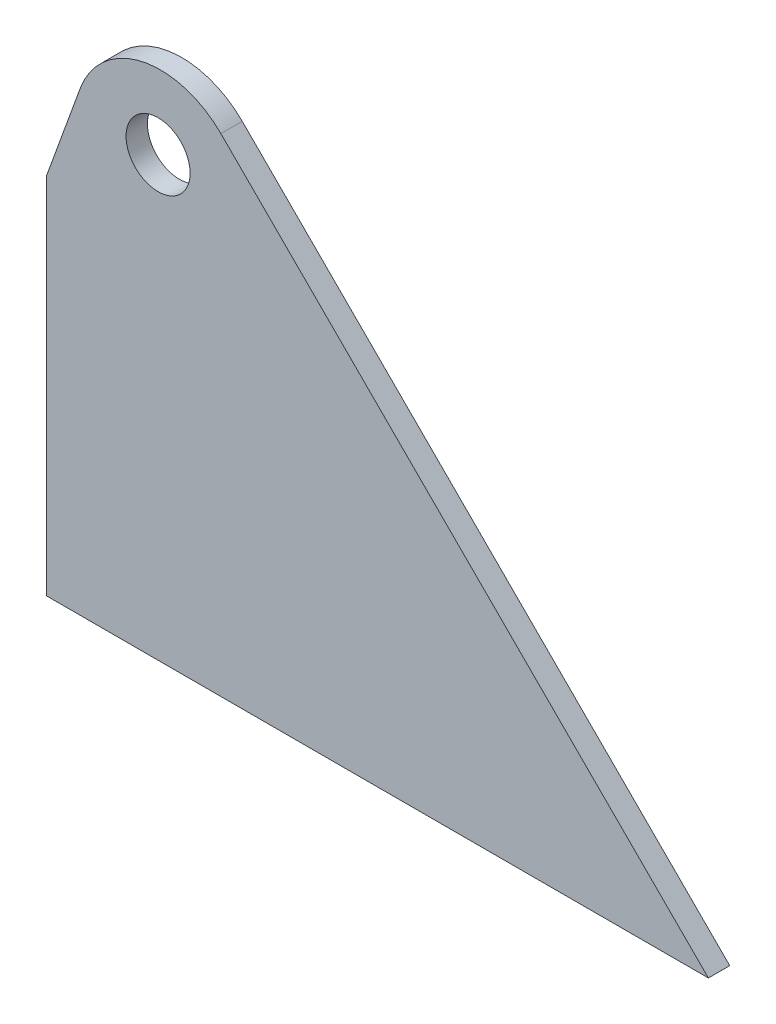
ISO-10303-21;
HEADER;
FILE_DESCRIPTION(('STEP AP214'),'2;1');
FILE_NAME('part.step','',(''),(''),'','','');
FILE_SCHEMA(('AUTOMOTIVE_DESIGN { 1 0 10303 214 1 1 1 1 }'));
ENDSEC;
DATA;
#1=APPLICATION_CONTEXT('core data for automotive mechanical design processes');
#2=APPLICATION_PROTOCOL_DEFINITION('international standard','automotive_design',2000,#1);
#3=PRODUCT_CONTEXT('',#1,'mechanical');
#4=PRODUCT('Part','Part','',(#3));
#5=PRODUCT_RELATED_PRODUCT_CATEGORY('part','',(#4));
#6=PRODUCT_DEFINITION_FORMATION('','',#4);
#7=PRODUCT_DEFINITION_CONTEXT('part definition',#1,'design');
#8=PRODUCT_DEFINITION('design','',#6,#7);
#9=PRODUCT_DEFINITION_SHAPE('','',#8);
#10=(LENGTH_UNIT() NAMED_UNIT(*) SI_UNIT(.MILLI.,.METRE.));
#11=(NAMED_UNIT(*) PLANE_ANGLE_UNIT() SI_UNIT($,.RADIAN.));
#12=(NAMED_UNIT(*) SI_UNIT($,.STERADIAN.) SOLID_ANGLE_UNIT());
#13=UNCERTAINTY_MEASURE_WITH_UNIT(LENGTH_MEASURE(1.E-05),#10,'distance_accuracy_value','');
#14=(GEOMETRIC_REPRESENTATION_CONTEXT(3) GLOBAL_UNCERTAINTY_ASSIGNED_CONTEXT((#13)) GLOBAL_UNIT_ASSIGNED_CONTEXT((#10,
#11,#12)) REPRESENTATION_CONTEXT('',''));
#15=CARTESIAN_POINT('',(0.,0.,0.));
#16=DIRECTION('',(0.,0.,1.));
#17=DIRECTION('',(1.,0.,0.));
#18=AXIS2_PLACEMENT_3D('',#15,#16,#17);
#19=CARTESIAN_POINT('',(53.471605318108,199.959852186968,10.));
#20=DIRECTION('',(0.,0.,1.));
#21=DIRECTION('',(1.,0.,0.));
#22=AXIS2_PLACEMENT_3D('',#19,#20,#21);
#23=PLANE('',#22);
#24=DIRECTION('',(1.,0.,0.));
#25=VECTOR('',#24,1.);
#26=CARTESIAN_POINT('',(309.999999999999,0.,10.));
#27=LINE('',#26,#25);
#28=CARTESIAN_POINT('',(0.,0.,10.));
#29=VERTEX_POINT('',#28);
#30=CARTESIAN_POINT('',(309.999999999999,0.,10.));
#31=VERTEX_POINT('',#30);
#32=EDGE_CURVE('E116',#29,#31,#27,.T.);
#33=ORIENTED_EDGE('',*,*,#32,.T.);
#34=DIRECTION('',(-0.707106781186546,0.707106781186549,0.));
#35=VECTOR('',#34,1.);
#36=CARTESIAN_POINT('',(309.999999999999,0.,10.));
#37=LINE('',#36,#35);
#38=CARTESIAN_POINT('',(81.7558765655699,228.24412343443,10.));
#39=VERTEX_POINT('',#38);
#40=EDGE_CURVE('E83',#31,#39,#37,.T.);
#41=ORIENTED_EDGE('',*,*,#40,.T.);
#42=CARTESIAN_POINT('',(53.471605318108,199.959852186968,10.));
#43=DIRECTION('',(0.,0.,1.));
#44=DIRECTION('',(1.,0.,0.));
#45=AXIS2_PLACEMENT_3D('',#42,#43,#44);
#46=CIRCLE('',#45,40.);
#47=CARTESIAN_POINT('',(15.8839004866716,213.640657919995,10.));
#48=VERTEX_POINT('',#47);
#49=EDGE_CURVE('E87',#39,#48,#46,.T.);
#50=ORIENTED_EDGE('',*,*,#49,.T.);
#51=DIRECTION('',(-0.342020143325666,-0.93969262078591,0.));
#52=VECTOR('',#51,1.);
#53=CARTESIAN_POINT('',(15.8839004866716,213.640657919995,10.));
#54=LINE('',#53,#52);
#55=CARTESIAN_POINT('',(0.,170.,10.));
#56=VERTEX_POINT('',#55);
#57=EDGE_CURVE('E91',#48,#56,#54,.T.);
#58=ORIENTED_EDGE('',*,*,#57,.T.);
#59=DIRECTION('',(0.,-1.,0.));
#60=VECTOR('',#59,1.);
#61=CARTESIAN_POINT('',(0.,0.,10.));
#62=LINE('',#61,#60);
#63=EDGE_CURVE('E49',#56,#29,#62,.T.);
#64=ORIENTED_EDGE('',*,*,#63,.T.);
#65=EDGE_LOOP('',(#33,#41,#50,#58,#64));
#66=FACE_BOUND('',#65,.T.);
#67=CARTESIAN_POINT('',(52.3542314490274,205.,10.));
#68=DIRECTION('',(0.,0.,1.));
#69=DIRECTION('',(1.,0.,0.));
#70=AXIS2_PLACEMENT_3D('',#67,#68,#69);
#71=CIRCLE('',#70,15.);
#72=CARTESIAN_POINT('',(67.3542314490274,205.,10.));
#73=VERTEX_POINT('',#72);
#74=EDGE_CURVE('E111',#73,#73,#71,.T.);
#75=ORIENTED_EDGE('',*,*,#74,.F.);
#76=EDGE_LOOP('',(#75));
#77=FACE_BOUND('',#76,.T.);
#78=ADVANCED_FACE('F32',(#66,#77),#23,.T.);
#79=CARTESIAN_POINT('',(53.471605318108,199.959852186968,0.));
#80=DIRECTION('',(0.,0.,1.));
#81=DIRECTION('',(1.,0.,0.));
#82=AXIS2_PLACEMENT_3D('',#79,#80,#81);
#83=PLANE('',#82);
#84=DIRECTION('',(1.,0.,0.));
#85=VECTOR('',#84,1.);
#86=CARTESIAN_POINT('',(309.999999999999,0.,0.));
#87=LINE('',#86,#85);
#88=CARTESIAN_POINT('',(0.,0.,0.));
#89=VERTEX_POINT('',#88);
#90=CARTESIAN_POINT('',(309.999999999999,0.,0.));
#91=VERTEX_POINT('',#90);
#92=EDGE_CURVE('E107',#89,#91,#87,.T.);
#93=ORIENTED_EDGE('',*,*,#92,.F.);
#94=DIRECTION('',(0.,-1.,0.));
#95=VECTOR('',#94,1.);
#96=CARTESIAN_POINT('',(0.,0.,0.));
#97=LINE('',#96,#95);
#98=CARTESIAN_POINT('',(0.,170.,0.));
#99=VERTEX_POINT('',#98);
#100=EDGE_CURVE('E75',#99,#89,#97,.T.);
#101=ORIENTED_EDGE('',*,*,#100,.F.);
#102=DIRECTION('',(-0.342020143325666,-0.93969262078591,0.));
#103=VECTOR('',#102,1.);
#104=CARTESIAN_POINT('',(15.8839004866716,213.640657919995,0.));
#105=LINE('',#104,#103);
#106=CARTESIAN_POINT('',(15.8839004866716,213.640657919995,0.));
#107=VERTEX_POINT('',#106);
#108=EDGE_CURVE('E69',#107,#99,#105,.T.);
#109=ORIENTED_EDGE('',*,*,#108,.F.);
#110=CARTESIAN_POINT('',(53.471605318108,199.959852186968,0.));
#111=DIRECTION('',(0.,0.,1.));
#112=DIRECTION('',(1.,0.,0.));
#113=AXIS2_PLACEMENT_3D('',#110,#111,#112);
#114=CIRCLE('',#113,40.);
#115=CARTESIAN_POINT('',(81.7558765655699,228.24412343443,0.));
#116=VERTEX_POINT('',#115);
#117=EDGE_CURVE('E98',#116,#107,#114,.T.);
#118=ORIENTED_EDGE('',*,*,#117,.F.);
#119=DIRECTION('',(-0.707106781186545,0.707106781186551,0.));
#120=VECTOR('',#119,1.);
#121=CARTESIAN_POINT('',(90.,220.,0.));
#122=LINE('',#121,#120);
#123=EDGE_CURVE('E110',#91,#116,#122,.T.);
#124=ORIENTED_EDGE('',*,*,#123,.F.);
#125=EDGE_LOOP('',(#93,#101,#109,#118,#124));
#126=FACE_BOUND('',#125,.T.);
#127=CARTESIAN_POINT('',(52.3542314490274,205.,0.));
#128=DIRECTION('',(0.,0.,1.));
#129=DIRECTION('',(1.,0.,0.));
#130=AXIS2_PLACEMENT_3D('',#127,#128,#129);
#131=CIRCLE('',#130,15.);
#132=CARTESIAN_POINT('',(67.3542314490274,205.,0.));
#133=VERTEX_POINT('',#132);
#134=EDGE_CURVE('E202',#133,#133,#131,.T.);
#135=ORIENTED_EDGE('',*,*,#134,.T.);
#136=EDGE_LOOP('',(#135));
#137=FACE_BOUND('',#136,.T.);
#138=ADVANCED_FACE('F120',(#126,#137),#83,.F.);
#139=CARTESIAN_POINT('',(309.999999999999,0.,10.));
#140=DIRECTION('',(0.,1.,0.));
#141=DIRECTION('',(-1.,0.,0.));
#142=AXIS2_PLACEMENT_3D('',#139,#140,#141);
#143=PLANE('',#142);
#144=ORIENTED_EDGE('',*,*,#92,.T.);
#145=DIRECTION('',(0.,0.,-1.));
#146=VECTOR('',#145,1.);
#147=CARTESIAN_POINT('',(309.999999999999,0.,10.));
#148=LINE('',#147,#146);
#149=EDGE_CURVE('E11',#31,#91,#148,.T.);
#150=ORIENTED_EDGE('',*,*,#149,.F.);
#151=ORIENTED_EDGE('',*,*,#32,.F.);
#152=DIRECTION('',(0.,0.,-1.));
#153=VECTOR('',#152,1.);
#154=CARTESIAN_POINT('',(0.,0.,10.));
#155=LINE('',#154,#153);
#156=EDGE_CURVE('E103',#29,#89,#155,.T.);
#157=ORIENTED_EDGE('',*,*,#156,.T.);
#158=EDGE_LOOP('',(#144,#150,#151,#157));
#159=FACE_BOUND('',#158,.T.);
#160=ADVANCED_FACE('F34',(#159),#143,.F.);
#161=CARTESIAN_POINT('',(90.,220.,10.));
#162=DIRECTION('',(-0.707106781186551,-0.707106781186545,0.));
#163=DIRECTION('',(0.707106781186545,-0.70710678118655,0.));
#164=AXIS2_PLACEMENT_3D('',#161,#162,#163);
#165=PLANE('',#164);
#166=ORIENTED_EDGE('',*,*,#123,.T.);
#167=DIRECTION('',(0.,0.,-1.));
#168=VECTOR('',#167,1.);
#169=CARTESIAN_POINT('',(81.7558765655699,228.24412343443,10.));
#170=LINE('',#169,#168);
#171=EDGE_CURVE('E41',#39,#116,#170,.T.);
#172=ORIENTED_EDGE('',*,*,#171,.F.);
#173=ORIENTED_EDGE('',*,*,#40,.F.);
#174=ORIENTED_EDGE('',*,*,#149,.T.);
#175=EDGE_LOOP('',(#166,#172,#173,#174));
#176=FACE_BOUND('',#175,.T.);
#177=ADVANCED_FACE('F145',(#176),#165,.F.);
#178=CARTESIAN_POINT('',(53.471605318108,199.959852186968,10.));
#179=DIRECTION('',(0.,0.,-1.));
#180=DIRECTION('',(-1.,0.,0.));
#181=AXIS2_PLACEMENT_3D('',#178,#179,#180);
#182=CYLINDRICAL_SURFACE('',#181,40.);
#183=ORIENTED_EDGE('',*,*,#117,.T.);
#184=DIRECTION('',(0.,0.,-1.));
#185=VECTOR('',#184,1.);
#186=CARTESIAN_POINT('',(15.8839004866716,213.640657919995,10.));
#187=LINE('',#186,#185);
#188=EDGE_CURVE('E95',#48,#107,#187,.T.);
#189=ORIENTED_EDGE('',*,*,#188,.F.);
#190=ORIENTED_EDGE('',*,*,#49,.F.);
#191=ORIENTED_EDGE('',*,*,#171,.T.);
#192=EDGE_LOOP('',(#183,#189,#190,#191));
#193=FACE_BOUND('',#192,.T.);
#194=ADVANCED_FACE('F96',(#193),#182,.T.);
#195=CARTESIAN_POINT('',(15.8839004866716,213.640657919995,10.));
#196=DIRECTION('',(0.939692620785909,-0.342020143325666,0.));
#197=DIRECTION('',(0.342020143325666,0.93969262078591,0.));
#198=AXIS2_PLACEMENT_3D('',#195,#196,#197);
#199=PLANE('',#198);
#200=ORIENTED_EDGE('',*,*,#108,.T.);
#201=DIRECTION('',(0.,0.,-1.));
#202=VECTOR('',#201,1.);
#203=CARTESIAN_POINT('',(0.,170.,10.));
#204=LINE('',#203,#202);
#205=EDGE_CURVE('E99',#56,#99,#204,.T.);
#206=ORIENTED_EDGE('',*,*,#205,.F.);
#207=ORIENTED_EDGE('',*,*,#57,.F.);
#208=ORIENTED_EDGE('',*,*,#188,.T.);
#209=EDGE_LOOP('',(#200,#206,#207,#208));
#210=FACE_BOUND('',#209,.T.);
#211=ADVANCED_FACE('F101',(#210),#199,.F.);
#212=CARTESIAN_POINT('',(0.,0.,10.));
#213=DIRECTION('',(1.,0.,0.));
#214=DIRECTION('',(0.,0.,-1.));
#215=AXIS2_PLACEMENT_3D('',#212,#213,#214);
#216=PLANE('',#215);
#217=ORIENTED_EDGE('',*,*,#100,.T.);
#218=ORIENTED_EDGE('',*,*,#156,.F.);
#219=ORIENTED_EDGE('',*,*,#63,.F.);
#220=ORIENTED_EDGE('',*,*,#205,.T.);
#221=EDGE_LOOP('',(#217,#218,#219,#220));
#222=FACE_BOUND('',#221,.T.);
#223=ADVANCED_FACE('F125',(#222),#216,.F.);
#224=CARTESIAN_POINT('',(52.3542314490274,205.,10.));
#225=DIRECTION('',(0.,0.,-1.));
#226=DIRECTION('',(-1.,0.,0.));
#227=AXIS2_PLACEMENT_3D('',#224,#225,#226);
#228=CYLINDRICAL_SURFACE('',#227,15.);
#229=ORIENTED_EDGE('',*,*,#74,.T.);
#230=EDGE_LOOP('',(#229));
#231=FACE_BOUND('',#230,.T.);
#232=ORIENTED_EDGE('',*,*,#134,.F.);
#233=EDGE_LOOP('',(#232));
#234=FACE_BOUND('',#233,.T.);
#235=ADVANCED_FACE('F127',(#231,#234),#228,.F.);
#236=CLOSED_SHELL('',(#78,#138,#160,#177,#194,#211,#223,#235));
#237=MANIFOLD_SOLID_BREP('B2',#236);
#238=ADVANCED_BREP_SHAPE_REPRESENTATION('',(#18,#237),#14);
#239=SHAPE_DEFINITION_REPRESENTATION(#9,#238);
ENDSEC;
END-ISO-10303-21;
